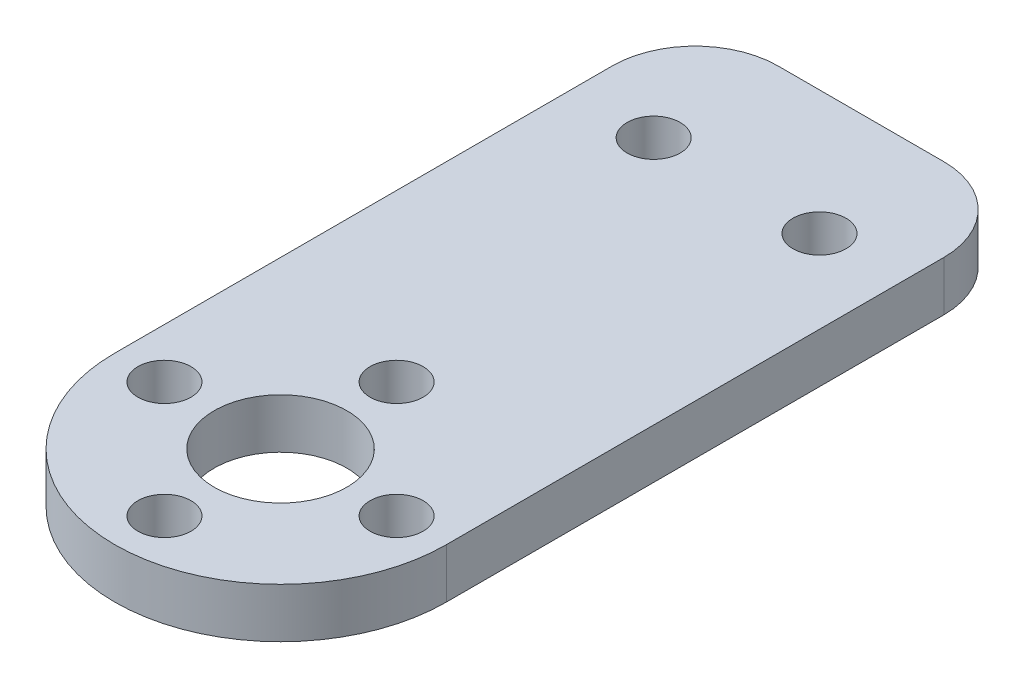
ISO-10303-21;
HEADER;
FILE_DESCRIPTION(('STEP AP214'),'2;1');
FILE_NAME('part.step','',(''),(''),'','','');
FILE_SCHEMA(('AUTOMOTIVE_DESIGN { 1 0 10303 214 1 1 1 1 }'));
ENDSEC;
DATA;
#1=APPLICATION_CONTEXT('core data for automotive mechanical design processes');
#2=APPLICATION_PROTOCOL_DEFINITION('international standard','automotive_design',2000,#1);
#3=PRODUCT_CONTEXT('',#1,'mechanical');
#4=PRODUCT('Part','Part','',(#3));
#5=PRODUCT_RELATED_PRODUCT_CATEGORY('part','',(#4));
#6=PRODUCT_DEFINITION_FORMATION('','',#4);
#7=PRODUCT_DEFINITION_CONTEXT('part definition',#1,'design');
#8=PRODUCT_DEFINITION('design','',#6,#7);
#9=PRODUCT_DEFINITION_SHAPE('','',#8);
#10=(LENGTH_UNIT() NAMED_UNIT(*) SI_UNIT(.MILLI.,.METRE.));
#11=(NAMED_UNIT(*) PLANE_ANGLE_UNIT() SI_UNIT($,.RADIAN.));
#12=(NAMED_UNIT(*) SI_UNIT($,.STERADIAN.) SOLID_ANGLE_UNIT());
#13=UNCERTAINTY_MEASURE_WITH_UNIT(LENGTH_MEASURE(1.E-05),#10,'distance_accuracy_value','');
#14=(GEOMETRIC_REPRESENTATION_CONTEXT(3) GLOBAL_UNCERTAINTY_ASSIGNED_CONTEXT((#13)) GLOBAL_UNIT_ASSIGNED_CONTEXT((#10,
#11,#12)) REPRESENTATION_CONTEXT('',''));
#15=CARTESIAN_POINT('',(0.,0.,0.));
#16=DIRECTION('',(0.,0.,1.));
#17=DIRECTION('',(1.,0.,0.));
#18=AXIS2_PLACEMENT_3D('',#15,#16,#17);
#19=CARTESIAN_POINT('',(0.,3.,0.));
#20=DIRECTION('',(0.,-1.,0.));
#21=DIRECTION('',(0.,0.,-1.));
#22=AXIS2_PLACEMENT_3D('',#19,#20,#21);
#23=PLANE('',#22);
#24=DIRECTION('',(0.,0.,-1.));
#25=VECTOR('',#24,1.);
#26=CARTESIAN_POINT('',(10.,3.,-35.));
#27=LINE('',#26,#25);
#28=CARTESIAN_POINT('',(10.,3.,0.));
#29=VERTEX_POINT('',#28);
#30=CARTESIAN_POINT('',(10.,3.,-30.));
#31=VERTEX_POINT('',#30);
#32=EDGE_CURVE('E99',#29,#31,#27,.T.);
#33=ORIENTED_EDGE('',*,*,#32,.T.);
#34=CARTESIAN_POINT('',(5.00000000000001,3.,-30.));
#35=DIRECTION('',(0.,-1.,0.));
#36=DIRECTION('',(0.,0.,-1.));
#37=AXIS2_PLACEMENT_3D('',#34,#35,#36);
#38=CIRCLE('',#37,5.);
#39=CARTESIAN_POINT('',(5.00000000000001,3.,-35.));
#40=VERTEX_POINT('',#39);
#41=EDGE_CURVE('E54',#31,#40,#38,.F.);
#42=ORIENTED_EDGE('',*,*,#41,.T.);
#43=DIRECTION('',(-1.,0.,0.));
#44=VECTOR('',#43,1.);
#45=CARTESIAN_POINT('',(-10.,3.,-35.));
#46=LINE('',#45,#44);
#47=CARTESIAN_POINT('',(-5.00000000000001,3.,-35.));
#48=VERTEX_POINT('',#47);
#49=EDGE_CURVE('E107',#40,#48,#46,.T.);
#50=ORIENTED_EDGE('',*,*,#49,.T.);
#51=CARTESIAN_POINT('',(-5.00000000000001,3.,-30.));
#52=DIRECTION('',(0.,-1.,0.));
#53=DIRECTION('',(0.,0.,-1.));
#54=AXIS2_PLACEMENT_3D('',#51,#52,#53);
#55=CIRCLE('',#54,5.);
#56=CARTESIAN_POINT('',(-10.,3.,-30.));
#57=VERTEX_POINT('',#56);
#58=EDGE_CURVE('E61',#48,#57,#55,.F.);
#59=ORIENTED_EDGE('',*,*,#58,.T.);
#60=DIRECTION('',(0.,0.,1.));
#61=VECTOR('',#60,1.);
#62=CARTESIAN_POINT('',(-10.,3.,0.));
#63=LINE('',#62,#61);
#64=CARTESIAN_POINT('',(-10.,3.,0.));
#65=VERTEX_POINT('',#64);
#66=EDGE_CURVE('E112',#57,#65,#63,.T.);
#67=ORIENTED_EDGE('',*,*,#66,.T.);
#68=CARTESIAN_POINT('',(0.,3.,0.));
#69=DIRECTION('',(0.,1.,0.));
#70=DIRECTION('',(0.,0.,-1.));
#71=AXIS2_PLACEMENT_3D('',#68,#69,#70);
#72=CIRCLE('',#71,10.);
#73=EDGE_CURVE('E108',#65,#29,#72,.T.);
#74=ORIENTED_EDGE('',*,*,#73,.T.);
#75=EDGE_LOOP('',(#33,#42,#50,#59,#67,#74));
#76=FACE_BOUND('',#75,.T.);
#77=CARTESIAN_POINT('',(0.,3.,0.));
#78=DIRECTION('',(0.,1.,0.));
#79=DIRECTION('',(0.,0.,1.));
#80=AXIS2_PLACEMENT_3D('',#77,#78,#79);
#81=CIRCLE('',#80,4.);
#82=CARTESIAN_POINT('',(0.,3.,4.));
#83=VERTEX_POINT('',#82);
#84=EDGE_CURVE('E167',#83,#83,#81,.T.);
#85=ORIENTED_EDGE('',*,*,#84,.F.);
#86=EDGE_LOOP('',(#85));
#87=FACE_BOUND('',#86,.T.);
#88=CARTESIAN_POINT('',(-5.,3.,-27.5));
#89=DIRECTION('',(0.,1.,0.));
#90=DIRECTION('',(0.,0.,1.));
#91=AXIS2_PLACEMENT_3D('',#88,#89,#90);
#92=CIRCLE('',#91,1.6);
#93=CARTESIAN_POINT('',(-5.,3.,-25.9));
#94=VERTEX_POINT('',#93);
#95=EDGE_CURVE('E355',#94,#94,#92,.T.);
#96=ORIENTED_EDGE('',*,*,#95,.F.);
#97=EDGE_LOOP('',(#96));
#98=FACE_BOUND('',#97,.T.);
#99=CARTESIAN_POINT('',(5.,3.,-27.5));
#100=DIRECTION('',(0.,1.,0.));
#101=DIRECTION('',(0.,0.,1.));
#102=AXIS2_PLACEMENT_3D('',#99,#100,#101);
#103=CIRCLE('',#102,1.6);
#104=CARTESIAN_POINT('',(5.,3.,-25.9));
#105=VERTEX_POINT('',#104);
#106=EDGE_CURVE('E347',#105,#105,#103,.T.);
#107=ORIENTED_EDGE('',*,*,#106,.F.);
#108=EDGE_LOOP('',(#107));
#109=FACE_BOUND('',#108,.T.);
#110=CARTESIAN_POINT('',(0.,3.,-7.));
#111=DIRECTION('',(0.,1.,0.));
#112=DIRECTION('',(0.,0.,1.));
#113=AXIS2_PLACEMENT_3D('',#110,#111,#112);
#114=CIRCLE('',#113,1.6);
#115=CARTESIAN_POINT('',(0.,3.,-5.4));
#116=VERTEX_POINT('',#115);
#117=EDGE_CURVE('E339',#116,#116,#114,.T.);
#118=ORIENTED_EDGE('',*,*,#117,.F.);
#119=EDGE_LOOP('',(#118));
#120=FACE_BOUND('',#119,.T.);
#121=CARTESIAN_POINT('',(-7.,3.,0.));
#122=DIRECTION('',(0.,1.,0.));
#123=DIRECTION('',(0.,0.,1.));
#124=AXIS2_PLACEMENT_3D('',#121,#122,#123);
#125=CIRCLE('',#124,1.6);
#126=CARTESIAN_POINT('',(-7.,3.,1.6));
#127=VERTEX_POINT('',#126);
#128=EDGE_CURVE('E331',#127,#127,#125,.T.);
#129=ORIENTED_EDGE('',*,*,#128,.F.);
#130=EDGE_LOOP('',(#129));
#131=FACE_BOUND('',#130,.T.);
#132=CARTESIAN_POINT('',(0.,3.,7.));
#133=DIRECTION('',(0.,1.,0.));
#134=DIRECTION('',(0.,0.,1.));
#135=AXIS2_PLACEMENT_3D('',#132,#133,#134);
#136=CIRCLE('',#135,1.6);
#137=CARTESIAN_POINT('',(0.,3.,8.6));
#138=VERTEX_POINT('',#137);
#139=EDGE_CURVE('E323',#138,#138,#136,.T.);
#140=ORIENTED_EDGE('',*,*,#139,.F.);
#141=EDGE_LOOP('',(#140));
#142=FACE_BOUND('',#141,.T.);
#143=CARTESIAN_POINT('',(7.,3.,0.));
#144=DIRECTION('',(0.,1.,0.));
#145=DIRECTION('',(0.,0.,1.));
#146=AXIS2_PLACEMENT_3D('',#143,#144,#145);
#147=CIRCLE('',#146,1.6);
#148=CARTESIAN_POINT('',(7.,3.,1.6));
#149=VERTEX_POINT('',#148);
#150=EDGE_CURVE('E312',#149,#149,#147,.T.);
#151=ORIENTED_EDGE('',*,*,#150,.F.);
#152=EDGE_LOOP('',(#151));
#153=FACE_BOUND('',#152,.T.);
#154=ADVANCED_FACE('F45',(#76,#87,#98,#109,#120,#131,#142,#153),#23,.F.);
#155=CARTESIAN_POINT('',(0.,0.,0.));
#156=DIRECTION('',(0.,-1.,0.));
#157=DIRECTION('',(0.,0.,-1.));
#158=AXIS2_PLACEMENT_3D('',#155,#156,#157);
#159=PLANE('',#158);
#160=CARTESIAN_POINT('',(0.,0.,7.));
#161=DIRECTION('',(0.,1.,0.));
#162=DIRECTION('',(0.,0.,1.));
#163=AXIS2_PLACEMENT_3D('',#160,#161,#162);
#164=CIRCLE('',#163,1.6);
#165=CARTESIAN_POINT('',(0.,0.,8.6));
#166=VERTEX_POINT('',#165);
#167=EDGE_CURVE('E320',#166,#166,#164,.T.);
#168=ORIENTED_EDGE('',*,*,#167,.T.);
#169=EDGE_LOOP('',(#168));
#170=FACE_BOUND('',#169,.T.);
#171=CARTESIAN_POINT('',(0.,0.,-7.));
#172=DIRECTION('',(0.,1.,0.));
#173=DIRECTION('',(0.,0.,1.));
#174=AXIS2_PLACEMENT_3D('',#171,#172,#173);
#175=CIRCLE('',#174,1.6);
#176=CARTESIAN_POINT('',(0.,0.,-5.4));
#177=VERTEX_POINT('',#176);
#178=EDGE_CURVE('E335',#177,#177,#175,.T.);
#179=ORIENTED_EDGE('',*,*,#178,.T.);
#180=EDGE_LOOP('',(#179));
#181=FACE_BOUND('',#180,.T.);
#182=CARTESIAN_POINT('',(-5.,0.,-27.5));
#183=DIRECTION('',(0.,1.,0.));
#184=DIRECTION('',(0.,0.,1.));
#185=AXIS2_PLACEMENT_3D('',#182,#183,#184);
#186=CIRCLE('',#185,1.6);
#187=CARTESIAN_POINT('',(-5.,0.,-25.9));
#188=VERTEX_POINT('',#187);
#189=EDGE_CURVE('E351',#188,#188,#186,.T.);
#190=ORIENTED_EDGE('',*,*,#189,.T.);
#191=EDGE_LOOP('',(#190));
#192=FACE_BOUND('',#191,.T.);
#193=DIRECTION('',(-1.,0.,0.));
#194=VECTOR('',#193,1.);
#195=CARTESIAN_POINT('',(-10.,0.,-35.));
#196=LINE('',#195,#194);
#197=CARTESIAN_POINT('',(5.00000000000001,0.,-35.));
#198=VERTEX_POINT('',#197);
#199=CARTESIAN_POINT('',(-5.00000000000001,0.,-35.));
#200=VERTEX_POINT('',#199);
#201=EDGE_CURVE('E161',#198,#200,#196,.T.);
#202=ORIENTED_EDGE('',*,*,#201,.F.);
#203=CARTESIAN_POINT('',(5.00000000000001,0.,-30.));
#204=DIRECTION('',(0.,-1.,0.));
#205=DIRECTION('',(0.,0.,-1.));
#206=AXIS2_PLACEMENT_3D('',#203,#204,#205);
#207=CIRCLE('',#206,5.);
#208=CARTESIAN_POINT('',(10.,0.,-30.));
#209=VERTEX_POINT('',#208);
#210=EDGE_CURVE('E139',#198,#209,#207,.T.);
#211=ORIENTED_EDGE('',*,*,#210,.T.);
#212=DIRECTION('',(0.,0.,-1.));
#213=VECTOR('',#212,1.);
#214=CARTESIAN_POINT('',(10.,0.,-35.));
#215=LINE('',#214,#213);
#216=CARTESIAN_POINT('',(10.,0.,0.));
#217=VERTEX_POINT('',#216);
#218=EDGE_CURVE('E160',#217,#209,#215,.T.);
#219=ORIENTED_EDGE('',*,*,#218,.F.);
#220=CARTESIAN_POINT('',(0.,0.,0.));
#221=DIRECTION('',(0.,1.,0.));
#222=DIRECTION('',(0.,0.,-1.));
#223=AXIS2_PLACEMENT_3D('',#220,#221,#222);
#224=CIRCLE('',#223,10.);
#225=CARTESIAN_POINT('',(-10.,0.,0.));
#226=VERTEX_POINT('',#225);
#227=EDGE_CURVE('E121',#226,#217,#224,.T.);
#228=ORIENTED_EDGE('',*,*,#227,.F.);
#229=DIRECTION('',(0.,0.,1.));
#230=VECTOR('',#229,1.);
#231=CARTESIAN_POINT('',(-10.,0.,0.));
#232=LINE('',#231,#230);
#233=CARTESIAN_POINT('',(-10.,0.,-30.));
#234=VERTEX_POINT('',#233);
#235=EDGE_CURVE('E117',#234,#226,#232,.T.);
#236=ORIENTED_EDGE('',*,*,#235,.F.);
#237=CARTESIAN_POINT('',(-5.00000000000001,0.,-30.));
#238=DIRECTION('',(0.,-1.,0.));
#239=DIRECTION('',(0.,0.,-1.));
#240=AXIS2_PLACEMENT_3D('',#237,#238,#239);
#241=CIRCLE('',#240,5.);
#242=EDGE_CURVE('E136',#234,#200,#241,.T.);
#243=ORIENTED_EDGE('',*,*,#242,.T.);
#244=EDGE_LOOP('',(#202,#211,#219,#228,#236,#243));
#245=FACE_BOUND('',#244,.T.);
#246=CARTESIAN_POINT('',(0.,0.,0.));
#247=DIRECTION('',(0.,1.,0.));
#248=DIRECTION('',(0.,0.,1.));
#249=AXIS2_PLACEMENT_3D('',#246,#247,#248);
#250=CIRCLE('',#249,4.);
#251=CARTESIAN_POINT('',(0.,0.,4.));
#252=VERTEX_POINT('',#251);
#253=EDGE_CURVE('E359',#252,#252,#250,.T.);
#254=ORIENTED_EDGE('',*,*,#253,.T.);
#255=EDGE_LOOP('',(#254));
#256=FACE_BOUND('',#255,.T.);
#257=CARTESIAN_POINT('',(5.,0.,-27.5));
#258=DIRECTION('',(0.,1.,0.));
#259=DIRECTION('',(0.,0.,1.));
#260=AXIS2_PLACEMENT_3D('',#257,#258,#259);
#261=CIRCLE('',#260,1.6);
#262=CARTESIAN_POINT('',(5.,0.,-25.9));
#263=VERTEX_POINT('',#262);
#264=EDGE_CURVE('E343',#263,#263,#261,.T.);
#265=ORIENTED_EDGE('',*,*,#264,.T.);
#266=EDGE_LOOP('',(#265));
#267=FACE_BOUND('',#266,.T.);
#268=CARTESIAN_POINT('',(-7.,0.,0.));
#269=DIRECTION('',(0.,1.,0.));
#270=DIRECTION('',(0.,0.,1.));
#271=AXIS2_PLACEMENT_3D('',#268,#269,#270);
#272=CIRCLE('',#271,1.6);
#273=CARTESIAN_POINT('',(-7.,0.,1.6));
#274=VERTEX_POINT('',#273);
#275=EDGE_CURVE('E327',#274,#274,#272,.T.);
#276=ORIENTED_EDGE('',*,*,#275,.T.);
#277=EDGE_LOOP('',(#276));
#278=FACE_BOUND('',#277,.T.);
#279=CARTESIAN_POINT('',(7.,0.,0.));
#280=DIRECTION('',(0.,1.,0.));
#281=DIRECTION('',(0.,0.,1.));
#282=AXIS2_PLACEMENT_3D('',#279,#280,#281);
#283=CIRCLE('',#282,1.6);
#284=CARTESIAN_POINT('',(7.,0.,1.6));
#285=VERTEX_POINT('',#284);
#286=EDGE_CURVE('E315',#285,#285,#283,.T.);
#287=ORIENTED_EDGE('',*,*,#286,.T.);
#288=EDGE_LOOP('',(#287));
#289=FACE_BOUND('',#288,.T.);
#290=ADVANCED_FACE('F158',(#170,#181,#192,#245,#256,#267,#278,#289),#159,.T.);
#291=CARTESIAN_POINT('',(0.,3.,0.));
#292=DIRECTION('',(0.,-1.,0.));
#293=DIRECTION('',(0.,0.,-1.));
#294=AXIS2_PLACEMENT_3D('',#291,#292,#293);
#295=CYLINDRICAL_SURFACE('',#294,10.);
#296=ORIENTED_EDGE('',*,*,#227,.T.);
#297=DIRECTION('',(0.,-1.,0.));
#298=VECTOR('',#297,1.);
#299=CARTESIAN_POINT('',(10.,3.,0.));
#300=LINE('',#299,#298);
#301=EDGE_CURVE('E103',#29,#217,#300,.T.);
#302=ORIENTED_EDGE('',*,*,#301,.F.);
#303=ORIENTED_EDGE('',*,*,#73,.F.);
#304=DIRECTION('',(0.,-1.,0.));
#305=VECTOR('',#304,1.);
#306=CARTESIAN_POINT('',(-10.,3.,0.));
#307=LINE('',#306,#305);
#308=EDGE_CURVE('E124',#65,#226,#307,.T.);
#309=ORIENTED_EDGE('',*,*,#308,.T.);
#310=EDGE_LOOP('',(#296,#302,#303,#309));
#311=FACE_BOUND('',#310,.T.);
#312=ADVANCED_FACE('F119',(#311),#295,.T.);
#313=CARTESIAN_POINT('',(10.,3.,-35.));
#314=DIRECTION('',(-1.,0.,0.));
#315=DIRECTION('',(0.,0.,1.));
#316=AXIS2_PLACEMENT_3D('',#313,#314,#315);
#317=PLANE('',#316);
#318=ORIENTED_EDGE('',*,*,#218,.T.);
#319=DIRECTION('',(0.,-1.,0.));
#320=VECTOR('',#319,1.);
#321=CARTESIAN_POINT('',(10.,3.,-30.));
#322=LINE('',#321,#320);
#323=EDGE_CURVE('E69',#209,#31,#322,.F.);
#324=ORIENTED_EDGE('',*,*,#323,.T.);
#325=ORIENTED_EDGE('',*,*,#32,.F.);
#326=ORIENTED_EDGE('',*,*,#301,.T.);
#327=EDGE_LOOP('',(#318,#324,#325,#326));
#328=FACE_BOUND('',#327,.T.);
#329=ADVANCED_FACE('F101',(#328),#317,.F.);
#330=CARTESIAN_POINT('',(-10.,3.,-35.));
#331=DIRECTION('',(0.,0.,1.));
#332=DIRECTION('',(1.,0.,0.));
#333=AXIS2_PLACEMENT_3D('',#330,#331,#332);
#334=PLANE('',#333);
#335=ORIENTED_EDGE('',*,*,#49,.F.);
#336=DIRECTION('',(0.,-1.,0.));
#337=VECTOR('',#336,1.);
#338=CARTESIAN_POINT('',(5.00000000000001,3.,-35.));
#339=LINE('',#338,#337);
#340=EDGE_CURVE('E128',#40,#198,#339,.T.);
#341=ORIENTED_EDGE('',*,*,#340,.T.);
#342=ORIENTED_EDGE('',*,*,#201,.T.);
#343=DIRECTION('',(0.,-1.,0.));
#344=VECTOR('',#343,1.);
#345=CARTESIAN_POINT('',(-5.00000000000001,3.,-35.));
#346=LINE('',#345,#344);
#347=EDGE_CURVE('E123',#200,#48,#346,.F.);
#348=ORIENTED_EDGE('',*,*,#347,.T.);
#349=EDGE_LOOP('',(#335,#341,#342,#348));
#350=FACE_BOUND('',#349,.T.);
#351=ADVANCED_FACE('F150',(#350),#334,.F.);
#352=CARTESIAN_POINT('',(-10.,3.,0.));
#353=DIRECTION('',(1.,0.,0.));
#354=DIRECTION('',(0.,0.,-1.));
#355=AXIS2_PLACEMENT_3D('',#352,#353,#354);
#356=PLANE('',#355);
#357=ORIENTED_EDGE('',*,*,#66,.F.);
#358=DIRECTION('',(0.,-1.,0.));
#359=VECTOR('',#358,1.);
#360=CARTESIAN_POINT('',(-10.,3.,-30.));
#361=LINE('',#360,#359);
#362=EDGE_CURVE('E11',#57,#234,#361,.T.);
#363=ORIENTED_EDGE('',*,*,#362,.T.);
#364=ORIENTED_EDGE('',*,*,#235,.T.);
#365=ORIENTED_EDGE('',*,*,#308,.F.);
#366=EDGE_LOOP('',(#357,#363,#364,#365));
#367=FACE_BOUND('',#366,.T.);
#368=ADVANCED_FACE('F173',(#367),#356,.F.);
#369=CARTESIAN_POINT('',(0.,3.,0.));
#370=DIRECTION('',(0.,-1.,0.));
#371=DIRECTION('',(0.,0.,-1.));
#372=AXIS2_PLACEMENT_3D('',#369,#370,#371);
#373=CYLINDRICAL_SURFACE('',#372,4.);
#374=ORIENTED_EDGE('',*,*,#84,.T.);
#375=EDGE_LOOP('',(#374));
#376=FACE_BOUND('',#375,.T.);
#377=ORIENTED_EDGE('',*,*,#253,.F.);
#378=EDGE_LOOP('',(#377));
#379=FACE_BOUND('',#378,.T.);
#380=ADVANCED_FACE('F190',(#376,#379),#373,.F.);
#381=CARTESIAN_POINT('',(-5.,3.,-27.5));
#382=DIRECTION('',(0.,-1.,0.));
#383=DIRECTION('',(0.,0.,-1.));
#384=AXIS2_PLACEMENT_3D('',#381,#382,#383);
#385=CYLINDRICAL_SURFACE('',#384,1.6);
#386=ORIENTED_EDGE('',*,*,#95,.T.);
#387=EDGE_LOOP('',(#386));
#388=FACE_BOUND('',#387,.T.);
#389=ORIENTED_EDGE('',*,*,#189,.F.);
#390=EDGE_LOOP('',(#389));
#391=FACE_BOUND('',#390,.T.);
#392=ADVANCED_FACE('F211',(#388,#391),#385,.F.);
#393=CARTESIAN_POINT('',(5.,3.,-27.5));
#394=DIRECTION('',(0.,-1.,0.));
#395=DIRECTION('',(0.,0.,-1.));
#396=AXIS2_PLACEMENT_3D('',#393,#394,#395);
#397=CYLINDRICAL_SURFACE('',#396,1.6);
#398=ORIENTED_EDGE('',*,*,#106,.T.);
#399=EDGE_LOOP('',(#398));
#400=FACE_BOUND('',#399,.T.);
#401=ORIENTED_EDGE('',*,*,#264,.F.);
#402=EDGE_LOOP('',(#401));
#403=FACE_BOUND('',#402,.T.);
#404=ADVANCED_FACE('F220',(#400,#403),#397,.F.);
#405=CARTESIAN_POINT('',(0.,3.,-7.));
#406=DIRECTION('',(0.,-1.,0.));
#407=DIRECTION('',(0.,0.,-1.));
#408=AXIS2_PLACEMENT_3D('',#405,#406,#407);
#409=CYLINDRICAL_SURFACE('',#408,1.6);
#410=ORIENTED_EDGE('',*,*,#117,.T.);
#411=EDGE_LOOP('',(#410));
#412=FACE_BOUND('',#411,.T.);
#413=ORIENTED_EDGE('',*,*,#178,.F.);
#414=EDGE_LOOP('',(#413));
#415=FACE_BOUND('',#414,.T.);
#416=ADVANCED_FACE('F228',(#412,#415),#409,.F.);
#417=CARTESIAN_POINT('',(-7.,3.,0.));
#418=DIRECTION('',(0.,-1.,0.));
#419=DIRECTION('',(0.,0.,-1.));
#420=AXIS2_PLACEMENT_3D('',#417,#418,#419);
#421=CYLINDRICAL_SURFACE('',#420,1.6);
#422=ORIENTED_EDGE('',*,*,#128,.T.);
#423=EDGE_LOOP('',(#422));
#424=FACE_BOUND('',#423,.T.);
#425=ORIENTED_EDGE('',*,*,#275,.F.);
#426=EDGE_LOOP('',(#425));
#427=FACE_BOUND('',#426,.T.);
#428=ADVANCED_FACE('F237',(#424,#427),#421,.F.);
#429=CARTESIAN_POINT('',(0.,3.,7.));
#430=DIRECTION('',(0.,-1.,0.));
#431=DIRECTION('',(0.,0.,-1.));
#432=AXIS2_PLACEMENT_3D('',#429,#430,#431);
#433=CYLINDRICAL_SURFACE('',#432,1.6);
#434=ORIENTED_EDGE('',*,*,#139,.T.);
#435=EDGE_LOOP('',(#434));
#436=FACE_BOUND('',#435,.T.);
#437=ORIENTED_EDGE('',*,*,#167,.F.);
#438=EDGE_LOOP('',(#437));
#439=FACE_BOUND('',#438,.T.);
#440=ADVANCED_FACE('F246',(#436,#439),#433,.F.);
#441=CARTESIAN_POINT('',(7.,3.,0.));
#442=DIRECTION('',(0.,-1.,0.));
#443=DIRECTION('',(0.,0.,-1.));
#444=AXIS2_PLACEMENT_3D('',#441,#442,#443);
#445=CYLINDRICAL_SURFACE('',#444,1.6);
#446=ORIENTED_EDGE('',*,*,#150,.T.);
#447=EDGE_LOOP('',(#446));
#448=FACE_BOUND('',#447,.T.);
#449=ORIENTED_EDGE('',*,*,#286,.F.);
#450=EDGE_LOOP('',(#449));
#451=FACE_BOUND('',#450,.T.);
#452=ADVANCED_FACE('F180',(#448,#451),#445,.F.);
#453=CARTESIAN_POINT('',(5.00000000000001,3.,-30.));
#454=DIRECTION('',(0.,-1.,0.));
#455=DIRECTION('',(0.,0.,-1.));
#456=AXIS2_PLACEMENT_3D('',#453,#454,#455);
#457=CYLINDRICAL_SURFACE('',#456,5.);
#458=ORIENTED_EDGE('',*,*,#41,.F.);
#459=ORIENTED_EDGE('',*,*,#323,.F.);
#460=ORIENTED_EDGE('',*,*,#210,.F.);
#461=ORIENTED_EDGE('',*,*,#340,.F.);
#462=EDGE_LOOP('',(#458,#459,#460,#461));
#463=FACE_BOUND('',#462,.T.);
#464=ADVANCED_FACE('F156',(#463),#457,.T.);
#465=CARTESIAN_POINT('',(-5.00000000000001,3.,-30.));
#466=DIRECTION('',(0.,-1.,0.));
#467=DIRECTION('',(0.,0.,-1.));
#468=AXIS2_PLACEMENT_3D('',#465,#466,#467);
#469=CYLINDRICAL_SURFACE('',#468,5.);
#470=ORIENTED_EDGE('',*,*,#58,.F.);
#471=ORIENTED_EDGE('',*,*,#347,.F.);
#472=ORIENTED_EDGE('',*,*,#242,.F.);
#473=ORIENTED_EDGE('',*,*,#362,.F.);
#474=EDGE_LOOP('',(#470,#471,#472,#473));
#475=FACE_BOUND('',#474,.T.);
#476=ADVANCED_FACE('F47',(#475),#469,.T.);
#477=CLOSED_SHELL('',(#154,#290,#312,#329,#351,#368,#380,#392,#404,#416,#428,#440,#452,#464,#476));
#478=MANIFOLD_SOLID_BREP('B2',#477);
#479=ADVANCED_BREP_SHAPE_REPRESENTATION('',(#18,#478),#14);
#480=SHAPE_DEFINITION_REPRESENTATION(#9,#479);
ENDSEC;
END-ISO-10303-21;
